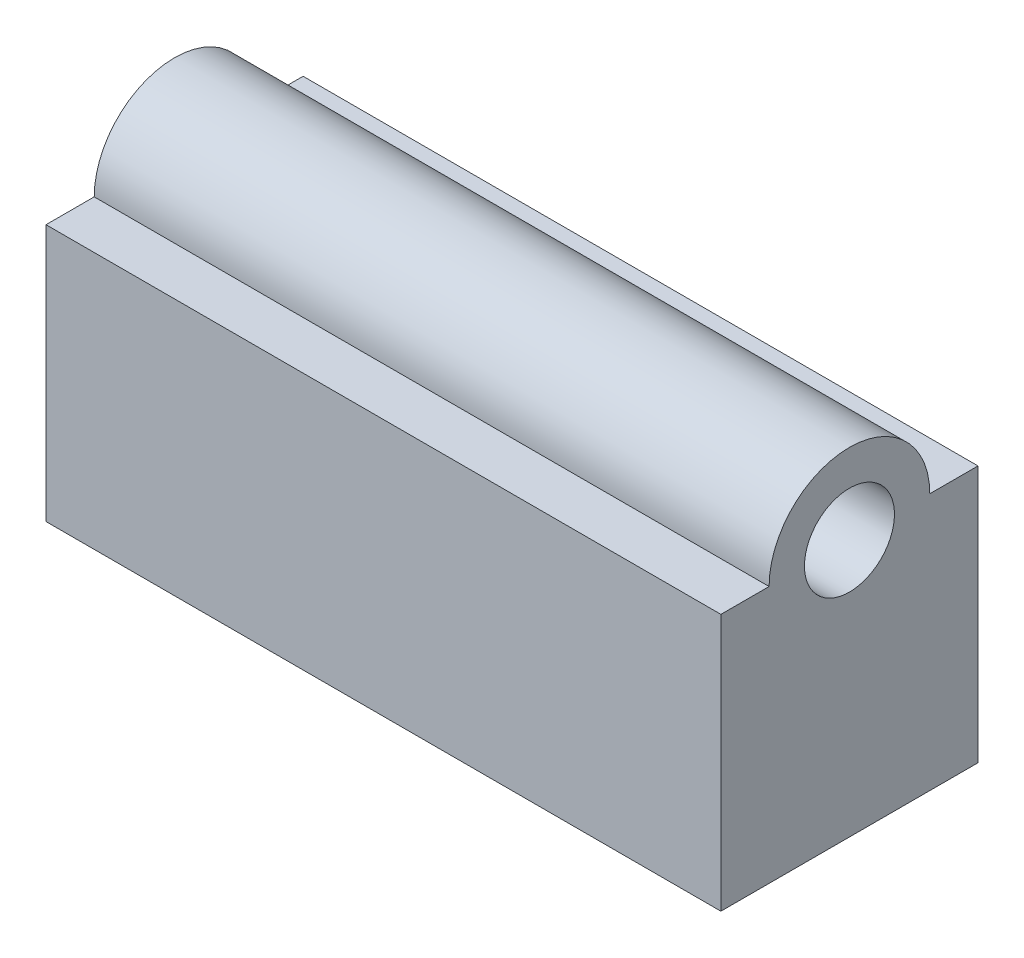
ISO-10303-21;
HEADER;
FILE_DESCRIPTION(('STEP AP214'),'2;1');
FILE_NAME('part.step','',(''),(''),'','','');
FILE_SCHEMA(('AUTOMOTIVE_DESIGN { 1 0 10303 214 1 1 1 1 }'));
ENDSEC;
DATA;
#1=APPLICATION_CONTEXT('core data for automotive mechanical design processes');
#2=APPLICATION_PROTOCOL_DEFINITION('international standard','automotive_design',2000,#1);
#3=PRODUCT_CONTEXT('',#1,'mechanical');
#4=PRODUCT('Part','Part','',(#3));
#5=PRODUCT_RELATED_PRODUCT_CATEGORY('part','',(#4));
#6=PRODUCT_DEFINITION_FORMATION('','',#4);
#7=PRODUCT_DEFINITION_CONTEXT('part definition',#1,'design');
#8=PRODUCT_DEFINITION('design','',#6,#7);
#9=PRODUCT_DEFINITION_SHAPE('','',#8);
#10=(LENGTH_UNIT() NAMED_UNIT(*) SI_UNIT(.MILLI.,.METRE.));
#11=(NAMED_UNIT(*) PLANE_ANGLE_UNIT() SI_UNIT($,.RADIAN.));
#12=(NAMED_UNIT(*) SI_UNIT($,.STERADIAN.) SOLID_ANGLE_UNIT());
#13=UNCERTAINTY_MEASURE_WITH_UNIT(LENGTH_MEASURE(1.E-05),#10,'distance_accuracy_value','');
#14=(GEOMETRIC_REPRESENTATION_CONTEXT(3) GLOBAL_UNCERTAINTY_ASSIGNED_CONTEXT((#13)) GLOBAL_UNIT_ASSIGNED_CONTEXT((#10,
#11,#12)) REPRESENTATION_CONTEXT('',''));
#15=CARTESIAN_POINT('',(0.,0.,0.));
#16=DIRECTION('',(0.,0.,1.));
#17=DIRECTION('',(1.,0.,0.));
#18=AXIS2_PLACEMENT_3D('',#15,#16,#17);
#19=CARTESIAN_POINT('',(105.,50.,-40.));
#20=DIRECTION('',(-1.,0.,0.));
#21=DIRECTION('',(0.,0.,1.));
#22=AXIS2_PLACEMENT_3D('',#19,#20,#21);
#23=PLANE('',#22);
#24=DIRECTION('',(0.,0.,-1.));
#25=VECTOR('',#24,1.);
#26=CARTESIAN_POINT('',(105.,0.,-40.));
#27=LINE('',#26,#25);
#28=CARTESIAN_POINT('',(105.,0.,40.));
#29=VERTEX_POINT('',#28);
#30=CARTESIAN_POINT('',(105.,0.,-40.));
#31=VERTEX_POINT('',#30);
#32=EDGE_CURVE('E144',#29,#31,#27,.T.);
#33=ORIENTED_EDGE('',*,*,#32,.T.);
#34=DIRECTION('',(0.,-1.,0.));
#35=VECTOR('',#34,1.);
#36=CARTESIAN_POINT('',(105.,50.,-40.));
#37=LINE('',#36,#35);
#38=CARTESIAN_POINT('',(105.,80.,-40.));
#39=VERTEX_POINT('',#38);
#40=EDGE_CURVE('E11',#39,#31,#37,.T.);
#41=ORIENTED_EDGE('',*,*,#40,.F.);
#42=DIRECTION('',(0.,0.,-1.));
#43=VECTOR('',#42,1.);
#44=CARTESIAN_POINT('',(105.,80.,0.));
#45=LINE('',#44,#43);
#46=CARTESIAN_POINT('',(105.,80.,-25.));
#47=VERTEX_POINT('',#46);
#48=EDGE_CURVE('E122',#47,#39,#45,.T.);
#49=ORIENTED_EDGE('',*,*,#48,.F.);
#50=CARTESIAN_POINT('',(105.,80.,0.));
#51=DIRECTION('',(-1.,0.,0.));
#52=DIRECTION('',(0.,0.,1.));
#53=AXIS2_PLACEMENT_3D('',#50,#51,#52);
#54=CIRCLE('',#53,25.);
#55=CARTESIAN_POINT('',(105.,80.,25.));
#56=VERTEX_POINT('',#55);
#57=EDGE_CURVE('E112',#47,#56,#54,.F.);
#58=ORIENTED_EDGE('',*,*,#57,.T.);
#59=DIRECTION('',(0.,0.,-1.));
#60=VECTOR('',#59,1.);
#61=CARTESIAN_POINT('',(105.,80.,0.));
#62=LINE('',#61,#60);
#63=CARTESIAN_POINT('',(105.,80.,40.));
#64=VERTEX_POINT('',#63);
#65=EDGE_CURVE('E109',#64,#56,#62,.T.);
#66=ORIENTED_EDGE('',*,*,#65,.F.);
#67=DIRECTION('',(0.,-1.,0.));
#68=VECTOR('',#67,1.);
#69=CARTESIAN_POINT('',(105.,50.,40.));
#70=LINE('',#69,#68);
#71=EDGE_CURVE('E96',#64,#29,#70,.T.);
#72=ORIENTED_EDGE('',*,*,#71,.T.);
#73=EDGE_LOOP('',(#33,#41,#49,#58,#66,#72));
#74=FACE_BOUND('',#73,.T.);
#75=CARTESIAN_POINT('',(105.,80.,0.));
#76=DIRECTION('',(-1.,0.,0.));
#77=DIRECTION('',(0.,0.,1.));
#78=AXIS2_PLACEMENT_3D('',#75,#76,#77);
#79=CIRCLE('',#78,14.);
#80=CARTESIAN_POINT('',(105.,80.,14.));
#81=VERTEX_POINT('',#80);
#82=EDGE_CURVE('E196',#81,#81,#79,.F.);
#83=ORIENTED_EDGE('',*,*,#82,.F.);
#84=EDGE_LOOP('',(#83));
#85=FACE_BOUND('',#84,.T.);
#86=ADVANCED_FACE('F44',(#74,#85),#23,.F.);
#87=CARTESIAN_POINT('',(-105.,50.,-40.));
#88=DIRECTION('',(0.,0.,1.));
#89=DIRECTION('',(1.,0.,0.));
#90=AXIS2_PLACEMENT_3D('',#87,#88,#89);
#91=PLANE('',#90);
#92=DIRECTION('',(-1.,0.,0.));
#93=VECTOR('',#92,1.);
#94=CARTESIAN_POINT('',(-105.,0.,-40.));
#95=LINE('',#94,#93);
#96=CARTESIAN_POINT('',(-105.,0.,-40.));
#97=VERTEX_POINT('',#96);
#98=EDGE_CURVE('E147',#31,#97,#95,.T.);
#99=ORIENTED_EDGE('',*,*,#98,.T.);
#100=DIRECTION('',(0.,-1.,0.));
#101=VECTOR('',#100,1.);
#102=CARTESIAN_POINT('',(-105.,50.,-40.));
#103=LINE('',#102,#101);
#104=CARTESIAN_POINT('',(-105.,80.,-40.));
#105=VERTEX_POINT('',#104);
#106=EDGE_CURVE('E52',#105,#97,#103,.T.);
#107=ORIENTED_EDGE('',*,*,#106,.F.);
#108=DIRECTION('',(-1.,0.,0.));
#109=VECTOR('',#108,1.);
#110=CARTESIAN_POINT('',(202.082439194738,80.,-40.));
#111=LINE('',#110,#109);
#112=EDGE_CURVE('E127',#39,#105,#111,.T.);
#113=ORIENTED_EDGE('',*,*,#112,.F.);
#114=ORIENTED_EDGE('',*,*,#40,.T.);
#115=EDGE_LOOP('',(#99,#107,#113,#114));
#116=FACE_BOUND('',#115,.T.);
#117=ADVANCED_FACE('F168',(#116),#91,.F.);
#118=CARTESIAN_POINT('',(-105.,50.,-40.));
#119=DIRECTION('',(1.,0.,0.));
#120=DIRECTION('',(0.,0.,-1.));
#121=AXIS2_PLACEMENT_3D('',#118,#119,#120);
#122=PLANE('',#121);
#123=DIRECTION('',(0.,0.,1.));
#124=VECTOR('',#123,1.);
#125=CARTESIAN_POINT('',(-105.,0.,-40.));
#126=LINE('',#125,#124);
#127=CARTESIAN_POINT('',(-105.,0.,40.));
#128=VERTEX_POINT('',#127);
#129=EDGE_CURVE('E67',#97,#128,#126,.T.);
#130=ORIENTED_EDGE('',*,*,#129,.T.);
#131=DIRECTION('',(0.,-1.,0.));
#132=VECTOR('',#131,1.);
#133=CARTESIAN_POINT('',(-105.,50.,40.));
#134=LINE('',#133,#132);
#135=CARTESIAN_POINT('',(-105.,80.,40.));
#136=VERTEX_POINT('',#135);
#137=EDGE_CURVE('E106',#136,#128,#134,.T.);
#138=ORIENTED_EDGE('',*,*,#137,.F.);
#139=DIRECTION('',(0.,0.,1.));
#140=VECTOR('',#139,1.);
#141=CARTESIAN_POINT('',(-105.,80.,0.));
#142=LINE('',#141,#140);
#143=CARTESIAN_POINT('',(-105.,80.,25.));
#144=VERTEX_POINT('',#143);
#145=EDGE_CURVE('E120',#144,#136,#142,.T.);
#146=ORIENTED_EDGE('',*,*,#145,.F.);
#147=CARTESIAN_POINT('',(-105.,80.,0.));
#148=DIRECTION('',(-1.,0.,0.));
#149=DIRECTION('',(0.,0.,1.));
#150=AXIS2_PLACEMENT_3D('',#147,#148,#149);
#151=CIRCLE('',#150,25.);
#152=CARTESIAN_POINT('',(-105.,80.,-25.));
#153=VERTEX_POINT('',#152);
#154=EDGE_CURVE('E140',#144,#153,#151,.T.);
#155=ORIENTED_EDGE('',*,*,#154,.T.);
#156=DIRECTION('',(0.,0.,1.));
#157=VECTOR('',#156,1.);
#158=CARTESIAN_POINT('',(-105.,80.,0.));
#159=LINE('',#158,#157);
#160=EDGE_CURVE('E136',#105,#153,#159,.T.);
#161=ORIENTED_EDGE('',*,*,#160,.F.);
#162=ORIENTED_EDGE('',*,*,#106,.T.);
#163=EDGE_LOOP('',(#130,#138,#146,#155,#161,#162));
#164=FACE_BOUND('',#163,.T.);
#165=CARTESIAN_POINT('',(-105.,80.,0.));
#166=DIRECTION('',(-1.,0.,0.));
#167=DIRECTION('',(0.,0.,1.));
#168=AXIS2_PLACEMENT_3D('',#165,#166,#167);
#169=CIRCLE('',#168,14.);
#170=CARTESIAN_POINT('',(-105.,80.,14.));
#171=VERTEX_POINT('',#170);
#172=EDGE_CURVE('E141',#171,#171,#169,.T.);
#173=ORIENTED_EDGE('',*,*,#172,.F.);
#174=EDGE_LOOP('',(#173));
#175=FACE_BOUND('',#174,.T.);
#176=ADVANCED_FACE('F157',(#164,#175),#122,.F.);
#177=CARTESIAN_POINT('',(-105.,50.,40.));
#178=DIRECTION('',(0.,0.,-1.));
#179=DIRECTION('',(-1.,0.,0.));
#180=AXIS2_PLACEMENT_3D('',#177,#178,#179);
#181=PLANE('',#180);
#182=DIRECTION('',(1.,0.,0.));
#183=VECTOR('',#182,1.);
#184=CARTESIAN_POINT('',(-105.,0.,40.));
#185=LINE('',#184,#183);
#186=EDGE_CURVE('E59',#128,#29,#185,.T.);
#187=ORIENTED_EDGE('',*,*,#186,.T.);
#188=ORIENTED_EDGE('',*,*,#71,.F.);
#189=DIRECTION('',(-1.,0.,0.));
#190=VECTOR('',#189,1.);
#191=CARTESIAN_POINT('',(202.082439194738,80.,40.));
#192=LINE('',#191,#190);
#193=EDGE_CURVE('E100',#64,#136,#192,.T.);
#194=ORIENTED_EDGE('',*,*,#193,.T.);
#195=ORIENTED_EDGE('',*,*,#137,.T.);
#196=EDGE_LOOP('',(#187,#188,#194,#195));
#197=FACE_BOUND('',#196,.T.);
#198=ADVANCED_FACE('F98',(#197),#181,.F.);
#199=CARTESIAN_POINT('',(0.,0.,0.));
#200=DIRECTION('',(0.,1.,0.));
#201=DIRECTION('',(0.,0.,1.));
#202=AXIS2_PLACEMENT_3D('',#199,#200,#201);
#203=PLANE('',#202);
#204=ORIENTED_EDGE('',*,*,#32,.F.);
#205=ORIENTED_EDGE('',*,*,#186,.F.);
#206=ORIENTED_EDGE('',*,*,#129,.F.);
#207=ORIENTED_EDGE('',*,*,#98,.F.);
#208=EDGE_LOOP('',(#204,#205,#206,#207));
#209=FACE_BOUND('',#208,.T.);
#210=ADVANCED_FACE('F164',(#209),#203,.F.);
#211=CARTESIAN_POINT('',(202.082439194738,80.,0.));
#212=DIRECTION('',(0.,-1.,0.));
#213=DIRECTION('',(0.,0.,-1.));
#214=AXIS2_PLACEMENT_3D('',#211,#212,#213);
#215=PLANE('',#214);
#216=ORIENTED_EDGE('',*,*,#193,.F.);
#217=ORIENTED_EDGE('',*,*,#65,.T.);
#218=DIRECTION('',(-1.,0.,0.));
#219=VECTOR('',#218,1.);
#220=CARTESIAN_POINT('',(202.082439194738,80.,25.));
#221=LINE('',#220,#219);
#222=EDGE_CURVE('E116',#56,#144,#221,.T.);
#223=ORIENTED_EDGE('',*,*,#222,.T.);
#224=ORIENTED_EDGE('',*,*,#145,.T.);
#225=EDGE_LOOP('',(#216,#217,#223,#224));
#226=FACE_BOUND('',#225,.T.);
#227=ADVANCED_FACE('F118',(#226),#215,.F.);
#228=CARTESIAN_POINT('',(202.082439194738,80.,0.));
#229=DIRECTION('',(0.,-1.,0.));
#230=DIRECTION('',(0.,0.,-1.));
#231=AXIS2_PLACEMENT_3D('',#228,#229,#230);
#232=PLANE('',#231);
#233=DIRECTION('',(-1.,0.,0.));
#234=VECTOR('',#233,1.);
#235=CARTESIAN_POINT('',(202.082439194738,80.,-25.));
#236=LINE('',#235,#234);
#237=EDGE_CURVE('E137',#47,#153,#236,.T.);
#238=ORIENTED_EDGE('',*,*,#237,.F.);
#239=ORIENTED_EDGE('',*,*,#48,.T.);
#240=ORIENTED_EDGE('',*,*,#112,.T.);
#241=ORIENTED_EDGE('',*,*,#160,.T.);
#242=EDGE_LOOP('',(#238,#239,#240,#241));
#243=FACE_BOUND('',#242,.T.);
#244=ADVANCED_FACE('F167',(#243),#232,.F.);
#245=CARTESIAN_POINT('',(202.082439194738,80.,0.));
#246=DIRECTION('',(-1.,0.,0.));
#247=DIRECTION('',(0.,0.,1.));
#248=AXIS2_PLACEMENT_3D('',#245,#246,#247);
#249=CYLINDRICAL_SURFACE('',#248,14.);
#250=ORIENTED_EDGE('',*,*,#82,.T.);
#251=EDGE_LOOP('',(#250));
#252=FACE_BOUND('',#251,.T.);
#253=ORIENTED_EDGE('',*,*,#172,.T.);
#254=EDGE_LOOP('',(#253));
#255=FACE_BOUND('',#254,.T.);
#256=ADVANCED_FACE('F184',(#252,#255),#249,.F.);
#257=CARTESIAN_POINT('',(202.082439194738,80.,0.));
#258=DIRECTION('',(-1.,0.,0.));
#259=DIRECTION('',(0.,0.,1.));
#260=AXIS2_PLACEMENT_3D('',#257,#258,#259);
#261=CYLINDRICAL_SURFACE('',#260,25.);
#262=ORIENTED_EDGE('',*,*,#57,.F.);
#263=ORIENTED_EDGE('',*,*,#237,.T.);
#264=ORIENTED_EDGE('',*,*,#154,.F.);
#265=ORIENTED_EDGE('',*,*,#222,.F.);
#266=EDGE_LOOP('',(#262,#263,#264,#265));
#267=FACE_BOUND('',#266,.T.);
#268=ADVANCED_FACE('F185',(#267),#261,.T.);
#269=CLOSED_SHELL('',(#86,#117,#176,#198,#210,#227,#244,#256,#268));
#270=MANIFOLD_SOLID_BREP('B2',#269);
#271=ADVANCED_BREP_SHAPE_REPRESENTATION('',(#18,#270),#14);
#272=SHAPE_DEFINITION_REPRESENTATION(#9,#271);
ENDSEC;
END-ISO-10303-21;
